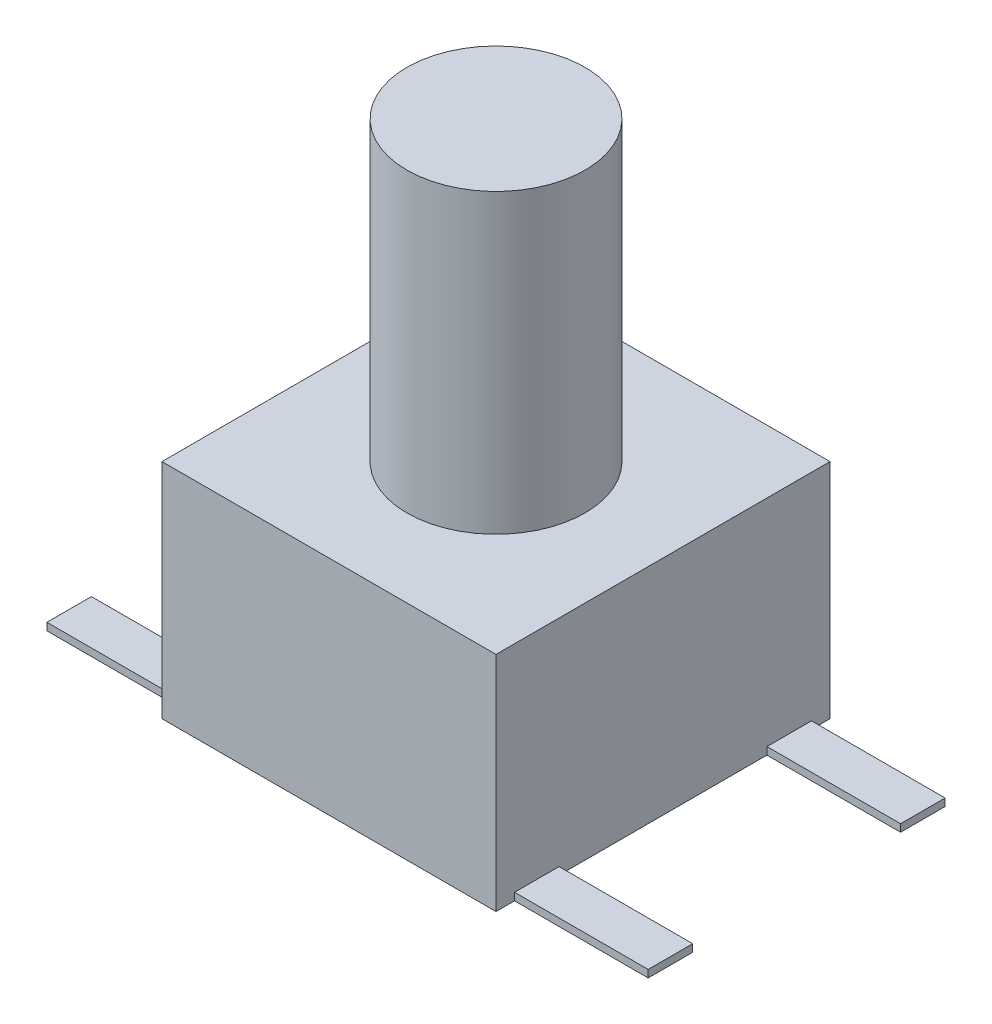
ISO-10303-21;
HEADER;
FILE_DESCRIPTION(('STEP AP214'),'2;1');
FILE_NAME('part.step','',(''),(''),'','','');
FILE_SCHEMA(('AUTOMOTIVE_DESIGN { 1 0 10303 214 1 1 1 1 }'));
ENDSEC;
DATA;
#1=APPLICATION_CONTEXT('core data for automotive mechanical design processes');
#2=APPLICATION_PROTOCOL_DEFINITION('international standard','automotive_design',2000,#1);
#3=PRODUCT_CONTEXT('',#1,'mechanical');
#4=PRODUCT('Part','Part','',(#3));
#5=PRODUCT_RELATED_PRODUCT_CATEGORY('part','',(#4));
#6=PRODUCT_DEFINITION_FORMATION('','',#4);
#7=PRODUCT_DEFINITION_CONTEXT('part definition',#1,'design');
#8=PRODUCT_DEFINITION('design','',#6,#7);
#9=PRODUCT_DEFINITION_SHAPE('','',#8);
#10=(LENGTH_UNIT() NAMED_UNIT(*) SI_UNIT(.MILLI.,.METRE.));
#11=(NAMED_UNIT(*) PLANE_ANGLE_UNIT() SI_UNIT($,.RADIAN.));
#12=(NAMED_UNIT(*) SI_UNIT($,.STERADIAN.) SOLID_ANGLE_UNIT());
#13=UNCERTAINTY_MEASURE_WITH_UNIT(LENGTH_MEASURE(1.E-05),#10,'distance_accuracy_value','');
#14=(GEOMETRIC_REPRESENTATION_CONTEXT(3) GLOBAL_UNCERTAINTY_ASSIGNED_CONTEXT((#13)) GLOBAL_UNIT_ASSIGNED_CONTEXT((#10,
#11,#12)) REPRESENTATION_CONTEXT('',''));
#15=CARTESIAN_POINT('',(0.,0.,0.));
#16=DIRECTION('',(0.,0.,1.));
#17=DIRECTION('',(1.,0.,0.));
#18=AXIS2_PLACEMENT_3D('',#15,#16,#17);
#19=CARTESIAN_POINT('',(2.25,0.1,2.));
#20=DIRECTION('',(0.,0.,-1.));
#21=DIRECTION('',(-1.,0.,0.));
#22=AXIS2_PLACEMENT_3D('',#19,#20,#21);
#23=PLANE('',#22);
#24=DIRECTION('',(1.,0.,0.));
#25=VECTOR('',#24,1.);
#26=CARTESIAN_POINT('',(2.25,0.,2.));
#27=LINE('',#26,#25);
#28=CARTESIAN_POINT('',(2.25,0.,2.));
#29=VERTEX_POINT('',#28);
#30=CARTESIAN_POINT('',(4.05,0.,2.));
#31=VERTEX_POINT('',#30);
#32=EDGE_CURVE('E111',#29,#31,#27,.T.);
#33=ORIENTED_EDGE('',*,*,#32,.T.);
#34=DIRECTION('',(0.,-1.,0.));
#35=VECTOR('',#34,1.);
#36=CARTESIAN_POINT('',(4.05,0.1,2.));
#37=LINE('',#36,#35);
#38=CARTESIAN_POINT('',(4.05,0.1,2.));
#39=VERTEX_POINT('',#38);
#40=EDGE_CURVE('E12',#39,#31,#37,.T.);
#41=ORIENTED_EDGE('',*,*,#40,.F.);
#42=DIRECTION('',(1.,0.,0.));
#43=VECTOR('',#42,1.);
#44=CARTESIAN_POINT('',(2.25,0.1,2.));
#45=LINE('',#44,#43);
#46=CARTESIAN_POINT('',(2.25,0.1,2.));
#47=VERTEX_POINT('',#46);
#48=EDGE_CURVE('E99',#47,#39,#45,.T.);
#49=ORIENTED_EDGE('',*,*,#48,.F.);
#50=DIRECTION('',(0.,-1.,0.));
#51=VECTOR('',#50,1.);
#52=CARTESIAN_POINT('',(2.25,0.1,2.));
#53=LINE('',#52,#51);
#54=EDGE_CURVE('E107',#47,#29,#53,.T.);
#55=ORIENTED_EDGE('',*,*,#54,.T.);
#56=EDGE_LOOP('',(#33,#41,#49,#55));
#57=FACE_BOUND('',#56,.T.);
#58=ADVANCED_FACE('F48',(#57),#23,.F.);
#59=CARTESIAN_POINT('',(4.05,0.1,2.));
#60=DIRECTION('',(-1.,0.,0.));
#61=DIRECTION('',(0.,0.,1.));
#62=AXIS2_PLACEMENT_3D('',#59,#60,#61);
#63=PLANE('',#62);
#64=DIRECTION('',(0.,0.,-1.));
#65=VECTOR('',#64,1.);
#66=CARTESIAN_POINT('',(4.05,0.,2.));
#67=LINE('',#66,#65);
#68=CARTESIAN_POINT('',(4.05,0.,1.4));
#69=VERTEX_POINT('',#68);
#70=EDGE_CURVE('E103',#31,#69,#67,.T.);
#71=ORIENTED_EDGE('',*,*,#70,.T.);
#72=DIRECTION('',(0.,-1.,0.));
#73=VECTOR('',#72,1.);
#74=CARTESIAN_POINT('',(4.05,0.1,1.4));
#75=LINE('',#74,#73);
#76=CARTESIAN_POINT('',(4.05,0.1,1.4));
#77=VERTEX_POINT('',#76);
#78=EDGE_CURVE('E56',#77,#69,#75,.T.);
#79=ORIENTED_EDGE('',*,*,#78,.F.);
#80=DIRECTION('',(0.,0.,-1.));
#81=VECTOR('',#80,1.);
#82=CARTESIAN_POINT('',(4.05,0.1,2.));
#83=LINE('',#82,#81);
#84=EDGE_CURVE('E94',#39,#77,#83,.T.);
#85=ORIENTED_EDGE('',*,*,#84,.F.);
#86=ORIENTED_EDGE('',*,*,#40,.T.);
#87=EDGE_LOOP('',(#71,#79,#85,#86));
#88=FACE_BOUND('',#87,.T.);
#89=ADVANCED_FACE('F102',(#88),#63,.F.);
#90=CARTESIAN_POINT('',(2.25,0.1,1.4));
#91=DIRECTION('',(0.,0.,1.));
#92=DIRECTION('',(1.,0.,0.));
#93=AXIS2_PLACEMENT_3D('',#90,#91,#92);
#94=PLANE('',#93);
#95=DIRECTION('',(-1.,0.,0.));
#96=VECTOR('',#95,1.);
#97=CARTESIAN_POINT('',(2.25,0.,1.4));
#98=LINE('',#97,#96);
#99=CARTESIAN_POINT('',(2.25,0.,1.4));
#100=VERTEX_POINT('',#99);
#101=EDGE_CURVE('E81',#69,#100,#98,.T.);
#102=ORIENTED_EDGE('',*,*,#101,.T.);
#103=DIRECTION('',(0.,-1.,0.));
#104=VECTOR('',#103,1.);
#105=CARTESIAN_POINT('',(2.25,0.1,1.4));
#106=LINE('',#105,#104);
#107=CARTESIAN_POINT('',(2.25,0.1,1.4));
#108=VERTEX_POINT('',#107);
#109=EDGE_CURVE('E104',#108,#100,#106,.T.);
#110=ORIENTED_EDGE('',*,*,#109,.F.);
#111=DIRECTION('',(-1.,0.,0.));
#112=VECTOR('',#111,1.);
#113=CARTESIAN_POINT('',(2.25,0.1,1.4));
#114=LINE('',#113,#112);
#115=EDGE_CURVE('E97',#77,#108,#114,.T.);
#116=ORIENTED_EDGE('',*,*,#115,.F.);
#117=ORIENTED_EDGE('',*,*,#78,.T.);
#118=EDGE_LOOP('',(#102,#110,#116,#117));
#119=FACE_BOUND('',#118,.T.);
#120=ADVANCED_FACE('F105',(#119),#94,.F.);
#121=CARTESIAN_POINT('',(2.25,0.1,2.));
#122=DIRECTION('',(1.,0.,0.));
#123=DIRECTION('',(0.,0.,-1.));
#124=AXIS2_PLACEMENT_3D('',#121,#122,#123);
#125=PLANE('',#124);
#126=DIRECTION('',(0.,0.,1.));
#127=VECTOR('',#126,1.);
#128=CARTESIAN_POINT('',(2.25,0.,2.));
#129=LINE('',#128,#127);
#130=EDGE_CURVE('E87',#100,#29,#129,.T.);
#131=ORIENTED_EDGE('',*,*,#130,.T.);
#132=ORIENTED_EDGE('',*,*,#54,.F.);
#133=DIRECTION('',(0.,0.,1.));
#134=VECTOR('',#133,1.);
#135=CARTESIAN_POINT('',(2.25,0.1,2.));
#136=LINE('',#135,#134);
#137=EDGE_CURVE('E64',#108,#47,#136,.T.);
#138=ORIENTED_EDGE('',*,*,#137,.F.);
#139=ORIENTED_EDGE('',*,*,#109,.T.);
#140=EDGE_LOOP('',(#131,#132,#138,#139));
#141=FACE_BOUND('',#140,.T.);
#142=ADVANCED_FACE('F118',(#141),#125,.F.);
#143=CARTESIAN_POINT('',(0.,0.1,0.));
#144=DIRECTION('',(0.,1.,0.));
#145=DIRECTION('',(0.,0.,1.));
#146=AXIS2_PLACEMENT_3D('',#143,#144,#145);
#147=PLANE('',#146);
#148=ORIENTED_EDGE('',*,*,#48,.T.);
#149=ORIENTED_EDGE('',*,*,#84,.T.);
#150=ORIENTED_EDGE('',*,*,#115,.T.);
#151=ORIENTED_EDGE('',*,*,#137,.T.);
#152=EDGE_LOOP('',(#148,#149,#150,#151));
#153=FACE_BOUND('',#152,.T.);
#154=ADVANCED_FACE('F95',(#153),#147,.T.);
#155=CARTESIAN_POINT('',(0.,0.,0.));
#156=DIRECTION('',(0.,1.,0.));
#157=DIRECTION('',(0.,0.,1.));
#158=AXIS2_PLACEMENT_3D('',#155,#156,#157);
#159=PLANE('',#158);
#160=ORIENTED_EDGE('',*,*,#32,.F.);
#161=ORIENTED_EDGE('',*,*,#130,.F.);
#162=ORIENTED_EDGE('',*,*,#101,.F.);
#163=ORIENTED_EDGE('',*,*,#70,.F.);
#164=EDGE_LOOP('',(#160,#161,#162,#163));
#165=FACE_BOUND('',#164,.T.);
#166=ADVANCED_FACE('F121',(#165),#159,.F.);
#167=CLOSED_SHELL('',(#58,#89,#120,#142,#154,#166));
#168=MANIFOLD_SOLID_BREP('B2',#167);
#169=CARTESIAN_POINT('',(2.25,0.1,-2.));
#170=DIRECTION('',(1.,0.,0.));
#171=DIRECTION('',(0.,0.,-1.));
#172=AXIS2_PLACEMENT_3D('',#169,#170,#171);
#173=PLANE('',#172);
#174=DIRECTION('',(0.,0.,1.));
#175=VECTOR('',#174,1.);
#176=CARTESIAN_POINT('',(2.25,0.,-2.));
#177=LINE('',#176,#175);
#178=CARTESIAN_POINT('',(2.25,0.,-2.));
#179=VERTEX_POINT('',#178);
#180=CARTESIAN_POINT('',(2.25,0.,-1.4));
#181=VERTEX_POINT('',#180);
#182=EDGE_CURVE('E245',#179,#181,#177,.T.);
#183=ORIENTED_EDGE('',*,*,#182,.T.);
#184=DIRECTION('',(0.,-1.,0.));
#185=VECTOR('',#184,1.);
#186=CARTESIAN_POINT('',(2.25,0.1,-1.4));
#187=LINE('',#186,#185);
#188=CARTESIAN_POINT('',(2.25,0.1,-1.4));
#189=VERTEX_POINT('',#188);
#190=EDGE_CURVE('E46',#189,#181,#187,.T.);
#191=ORIENTED_EDGE('',*,*,#190,.F.);
#192=DIRECTION('',(0.,0.,1.));
#193=VECTOR('',#192,1.);
#194=CARTESIAN_POINT('',(2.25,0.1,-2.));
#195=LINE('',#194,#193);
#196=CARTESIAN_POINT('',(2.25,0.1,-2.));
#197=VERTEX_POINT('',#196);
#198=EDGE_CURVE('E233',#197,#189,#195,.T.);
#199=ORIENTED_EDGE('',*,*,#198,.F.);
#200=DIRECTION('',(0.,-1.,0.));
#201=VECTOR('',#200,1.);
#202=CARTESIAN_POINT('',(2.25,0.1,-2.));
#203=LINE('',#202,#201);
#204=EDGE_CURVE('E241',#197,#179,#203,.T.);
#205=ORIENTED_EDGE('',*,*,#204,.T.);
#206=EDGE_LOOP('',(#183,#191,#199,#205));
#207=FACE_BOUND('',#206,.T.);
#208=ADVANCED_FACE('F182',(#207),#173,.F.);
#209=CARTESIAN_POINT('',(2.25,0.1,-1.4));
#210=DIRECTION('',(0.,0.,-1.));
#211=DIRECTION('',(-1.,0.,0.));
#212=AXIS2_PLACEMENT_3D('',#209,#210,#211);
#213=PLANE('',#212);
#214=DIRECTION('',(1.,0.,0.));
#215=VECTOR('',#214,1.);
#216=CARTESIAN_POINT('',(2.25,0.,-1.4));
#217=LINE('',#216,#215);
#218=CARTESIAN_POINT('',(4.05,0.,-1.4));
#219=VERTEX_POINT('',#218);
#220=EDGE_CURVE('E237',#181,#219,#217,.T.);
#221=ORIENTED_EDGE('',*,*,#220,.T.);
#222=DIRECTION('',(0.,-1.,0.));
#223=VECTOR('',#222,1.);
#224=CARTESIAN_POINT('',(4.05,0.1,-1.4));
#225=LINE('',#224,#223);
#226=CARTESIAN_POINT('',(4.05,0.1,-1.4));
#227=VERTEX_POINT('',#226);
#228=EDGE_CURVE('E190',#227,#219,#225,.T.);
#229=ORIENTED_EDGE('',*,*,#228,.F.);
#230=DIRECTION('',(1.,0.,0.));
#231=VECTOR('',#230,1.);
#232=CARTESIAN_POINT('',(2.25,0.1,-1.4));
#233=LINE('',#232,#231);
#234=EDGE_CURVE('E228',#189,#227,#233,.T.);
#235=ORIENTED_EDGE('',*,*,#234,.F.);
#236=ORIENTED_EDGE('',*,*,#190,.T.);
#237=EDGE_LOOP('',(#221,#229,#235,#236));
#238=FACE_BOUND('',#237,.T.);
#239=ADVANCED_FACE('F236',(#238),#213,.F.);
#240=CARTESIAN_POINT('',(4.05,0.1,-2.));
#241=DIRECTION('',(-1.,0.,0.));
#242=DIRECTION('',(0.,0.,1.));
#243=AXIS2_PLACEMENT_3D('',#240,#241,#242);
#244=PLANE('',#243);
#245=DIRECTION('',(0.,0.,-1.));
#246=VECTOR('',#245,1.);
#247=CARTESIAN_POINT('',(4.05,0.,-2.));
#248=LINE('',#247,#246);
#249=CARTESIAN_POINT('',(4.05,0.,-2.));
#250=VERTEX_POINT('',#249);
#251=EDGE_CURVE('E215',#219,#250,#248,.T.);
#252=ORIENTED_EDGE('',*,*,#251,.T.);
#253=DIRECTION('',(0.,-1.,0.));
#254=VECTOR('',#253,1.);
#255=CARTESIAN_POINT('',(4.05,0.1,-2.));
#256=LINE('',#255,#254);
#257=CARTESIAN_POINT('',(4.05,0.1,-2.));
#258=VERTEX_POINT('',#257);
#259=EDGE_CURVE('E238',#258,#250,#256,.T.);
#260=ORIENTED_EDGE('',*,*,#259,.F.);
#261=DIRECTION('',(0.,0.,-1.));
#262=VECTOR('',#261,1.);
#263=CARTESIAN_POINT('',(4.05,0.1,-2.));
#264=LINE('',#263,#262);
#265=EDGE_CURVE('E231',#227,#258,#264,.T.);
#266=ORIENTED_EDGE('',*,*,#265,.F.);
#267=ORIENTED_EDGE('',*,*,#228,.T.);
#268=EDGE_LOOP('',(#252,#260,#266,#267));
#269=FACE_BOUND('',#268,.T.);
#270=ADVANCED_FACE('F239',(#269),#244,.F.);
#271=CARTESIAN_POINT('',(2.25,0.1,-2.));
#272=DIRECTION('',(0.,0.,1.));
#273=DIRECTION('',(1.,0.,0.));
#274=AXIS2_PLACEMENT_3D('',#271,#272,#273);
#275=PLANE('',#274);
#276=DIRECTION('',(-1.,0.,0.));
#277=VECTOR('',#276,1.);
#278=CARTESIAN_POINT('',(2.25,0.,-2.));
#279=LINE('',#278,#277);
#280=EDGE_CURVE('E221',#250,#179,#279,.T.);
#281=ORIENTED_EDGE('',*,*,#280,.T.);
#282=ORIENTED_EDGE('',*,*,#204,.F.);
#283=DIRECTION('',(-1.,0.,0.));
#284=VECTOR('',#283,1.);
#285=CARTESIAN_POINT('',(2.25,0.1,-2.));
#286=LINE('',#285,#284);
#287=EDGE_CURVE('E198',#258,#197,#286,.T.);
#288=ORIENTED_EDGE('',*,*,#287,.F.);
#289=ORIENTED_EDGE('',*,*,#259,.T.);
#290=EDGE_LOOP('',(#281,#282,#288,#289));
#291=FACE_BOUND('',#290,.T.);
#292=ADVANCED_FACE('F252',(#291),#275,.F.);
#293=CARTESIAN_POINT('',(0.,0.1,0.));
#294=DIRECTION('',(0.,1.,0.));
#295=DIRECTION('',(0.,0.,1.));
#296=AXIS2_PLACEMENT_3D('',#293,#294,#295);
#297=PLANE('',#296);
#298=ORIENTED_EDGE('',*,*,#198,.T.);
#299=ORIENTED_EDGE('',*,*,#234,.T.);
#300=ORIENTED_EDGE('',*,*,#265,.T.);
#301=ORIENTED_EDGE('',*,*,#287,.T.);
#302=EDGE_LOOP('',(#298,#299,#300,#301));
#303=FACE_BOUND('',#302,.T.);
#304=ADVANCED_FACE('F229',(#303),#297,.T.);
#305=CARTESIAN_POINT('',(0.,0.,0.));
#306=DIRECTION('',(0.,1.,0.));
#307=DIRECTION('',(0.,0.,1.));
#308=AXIS2_PLACEMENT_3D('',#305,#306,#307);
#309=PLANE('',#308);
#310=ORIENTED_EDGE('',*,*,#182,.F.);
#311=ORIENTED_EDGE('',*,*,#280,.F.);
#312=ORIENTED_EDGE('',*,*,#251,.F.);
#313=ORIENTED_EDGE('',*,*,#220,.F.);
#314=EDGE_LOOP('',(#310,#311,#312,#313));
#315=FACE_BOUND('',#314,.T.);
#316=ADVANCED_FACE('F255',(#315),#309,.F.);
#317=CLOSED_SHELL('',(#208,#239,#270,#292,#304,#316));
#318=MANIFOLD_SOLID_BREP('B6',#317);
#319=CARTESIAN_POINT('',(-2.25,0.1,-2.));
#320=DIRECTION('',(0.,0.,1.));
#321=DIRECTION('',(1.,0.,0.));
#322=AXIS2_PLACEMENT_3D('',#319,#320,#321);
#323=PLANE('',#322);
#324=DIRECTION('',(-1.,0.,0.));
#325=VECTOR('',#324,1.);
#326=CARTESIAN_POINT('',(-2.25,0.,-2.));
#327=LINE('',#326,#325);
#328=CARTESIAN_POINT('',(-2.25,0.,-2.));
#329=VERTEX_POINT('',#328);
#330=CARTESIAN_POINT('',(-4.05,0.,-2.));
#331=VERTEX_POINT('',#330);
#332=EDGE_CURVE('E379',#329,#331,#327,.T.);
#333=ORIENTED_EDGE('',*,*,#332,.T.);
#334=DIRECTION('',(0.,-1.,0.));
#335=VECTOR('',#334,1.);
#336=CARTESIAN_POINT('',(-4.05,0.1,-2.));
#337=LINE('',#336,#335);
#338=CARTESIAN_POINT('',(-4.05,0.1,-2.));
#339=VERTEX_POINT('',#338);
#340=EDGE_CURVE('E180',#339,#331,#337,.T.);
#341=ORIENTED_EDGE('',*,*,#340,.F.);
#342=DIRECTION('',(-1.,0.,0.));
#343=VECTOR('',#342,1.);
#344=CARTESIAN_POINT('',(-2.25,0.1,-2.));
#345=LINE('',#344,#343);
#346=CARTESIAN_POINT('',(-2.25,0.1,-2.));
#347=VERTEX_POINT('',#346);
#348=EDGE_CURVE('E367',#347,#339,#345,.T.);
#349=ORIENTED_EDGE('',*,*,#348,.F.);
#350=DIRECTION('',(0.,-1.,0.));
#351=VECTOR('',#350,1.);
#352=CARTESIAN_POINT('',(-2.25,0.1,-2.));
#353=LINE('',#352,#351);
#354=EDGE_CURVE('E375',#347,#329,#353,.T.);
#355=ORIENTED_EDGE('',*,*,#354,.T.);
#356=EDGE_LOOP('',(#333,#341,#349,#355));
#357=FACE_BOUND('',#356,.T.);
#358=ADVANCED_FACE('F316',(#357),#323,.F.);
#359=CARTESIAN_POINT('',(-4.05,0.1,-2.));
#360=DIRECTION('',(1.,0.,0.));
#361=DIRECTION('',(0.,0.,-1.));
#362=AXIS2_PLACEMENT_3D('',#359,#360,#361);
#363=PLANE('',#362);
#364=DIRECTION('',(0.,0.,1.));
#365=VECTOR('',#364,1.);
#366=CARTESIAN_POINT('',(-4.05,0.,-2.));
#367=LINE('',#366,#365);
#368=CARTESIAN_POINT('',(-4.05,0.,-1.4));
#369=VERTEX_POINT('',#368);
#370=EDGE_CURVE('E371',#331,#369,#367,.T.);
#371=ORIENTED_EDGE('',*,*,#370,.T.);
#372=DIRECTION('',(0.,-1.,0.));
#373=VECTOR('',#372,1.);
#374=CARTESIAN_POINT('',(-4.05,0.1,-1.4));
#375=LINE('',#374,#373);
#376=CARTESIAN_POINT('',(-4.05,0.1,-1.4));
#377=VERTEX_POINT('',#376);
#378=EDGE_CURVE('E324',#377,#369,#375,.T.);
#379=ORIENTED_EDGE('',*,*,#378,.F.);
#380=DIRECTION('',(0.,0.,1.));
#381=VECTOR('',#380,1.);
#382=CARTESIAN_POINT('',(-4.05,0.1,-2.));
#383=LINE('',#382,#381);
#384=EDGE_CURVE('E362',#339,#377,#383,.T.);
#385=ORIENTED_EDGE('',*,*,#384,.F.);
#386=ORIENTED_EDGE('',*,*,#340,.T.);
#387=EDGE_LOOP('',(#371,#379,#385,#386));
#388=FACE_BOUND('',#387,.T.);
#389=ADVANCED_FACE('F370',(#388),#363,.F.);
#390=CARTESIAN_POINT('',(-2.25,0.1,-1.4));
#391=DIRECTION('',(0.,0.,-1.));
#392=DIRECTION('',(-1.,0.,0.));
#393=AXIS2_PLACEMENT_3D('',#390,#391,#392);
#394=PLANE('',#393);
#395=DIRECTION('',(1.,0.,0.));
#396=VECTOR('',#395,1.);
#397=CARTESIAN_POINT('',(-2.25,0.,-1.4));
#398=LINE('',#397,#396);
#399=CARTESIAN_POINT('',(-2.25,0.,-1.4));
#400=VERTEX_POINT('',#399);
#401=EDGE_CURVE('E349',#369,#400,#398,.T.);
#402=ORIENTED_EDGE('',*,*,#401,.T.);
#403=DIRECTION('',(0.,-1.,0.));
#404=VECTOR('',#403,1.);
#405=CARTESIAN_POINT('',(-2.25,0.1,-1.4));
#406=LINE('',#405,#404);
#407=CARTESIAN_POINT('',(-2.25,0.1,-1.4));
#408=VERTEX_POINT('',#407);
#409=EDGE_CURVE('E372',#408,#400,#406,.T.);
#410=ORIENTED_EDGE('',*,*,#409,.F.);
#411=DIRECTION('',(1.,0.,0.));
#412=VECTOR('',#411,1.);
#413=CARTESIAN_POINT('',(-2.25,0.1,-1.4));
#414=LINE('',#413,#412);
#415=EDGE_CURVE('E365',#377,#408,#414,.T.);
#416=ORIENTED_EDGE('',*,*,#415,.F.);
#417=ORIENTED_EDGE('',*,*,#378,.T.);
#418=EDGE_LOOP('',(#402,#410,#416,#417));
#419=FACE_BOUND('',#418,.T.);
#420=ADVANCED_FACE('F373',(#419),#394,.F.);
#421=CARTESIAN_POINT('',(-2.25,0.1,-2.));
#422=DIRECTION('',(-1.,0.,0.));
#423=DIRECTION('',(0.,0.,1.));
#424=AXIS2_PLACEMENT_3D('',#421,#422,#423);
#425=PLANE('',#424);
#426=DIRECTION('',(0.,0.,-1.));
#427=VECTOR('',#426,1.);
#428=CARTESIAN_POINT('',(-2.25,0.,-2.));
#429=LINE('',#428,#427);
#430=EDGE_CURVE('E355',#400,#329,#429,.T.);
#431=ORIENTED_EDGE('',*,*,#430,.T.);
#432=ORIENTED_EDGE('',*,*,#354,.F.);
#433=DIRECTION('',(0.,0.,-1.));
#434=VECTOR('',#433,1.);
#435=CARTESIAN_POINT('',(-2.25,0.1,-2.));
#436=LINE('',#435,#434);
#437=EDGE_CURVE('E332',#408,#347,#436,.T.);
#438=ORIENTED_EDGE('',*,*,#437,.F.);
#439=ORIENTED_EDGE('',*,*,#409,.T.);
#440=EDGE_LOOP('',(#431,#432,#438,#439));
#441=FACE_BOUND('',#440,.T.);
#442=ADVANCED_FACE('F386',(#441),#425,.F.);
#443=CARTESIAN_POINT('',(0.,0.1,0.));
#444=DIRECTION('',(0.,1.,0.));
#445=DIRECTION('',(0.,0.,1.));
#446=AXIS2_PLACEMENT_3D('',#443,#444,#445);
#447=PLANE('',#446);
#448=ORIENTED_EDGE('',*,*,#348,.T.);
#449=ORIENTED_EDGE('',*,*,#384,.T.);
#450=ORIENTED_EDGE('',*,*,#415,.T.);
#451=ORIENTED_EDGE('',*,*,#437,.T.);
#452=EDGE_LOOP('',(#448,#449,#450,#451));
#453=FACE_BOUND('',#452,.T.);
#454=ADVANCED_FACE('F363',(#453),#447,.T.);
#455=CARTESIAN_POINT('',(0.,0.,0.));
#456=DIRECTION('',(0.,1.,0.));
#457=DIRECTION('',(0.,0.,1.));
#458=AXIS2_PLACEMENT_3D('',#455,#456,#457);
#459=PLANE('',#458);
#460=ORIENTED_EDGE('',*,*,#332,.F.);
#461=ORIENTED_EDGE('',*,*,#430,.F.);
#462=ORIENTED_EDGE('',*,*,#401,.F.);
#463=ORIENTED_EDGE('',*,*,#370,.F.);
#464=EDGE_LOOP('',(#460,#461,#462,#463));
#465=FACE_BOUND('',#464,.T.);
#466=ADVANCED_FACE('F389',(#465),#459,.F.);
#467=CLOSED_SHELL('',(#358,#389,#420,#442,#454,#466));
#468=MANIFOLD_SOLID_BREP('B40',#467);
#469=CARTESIAN_POINT('',(-2.25,0.1,2.));
#470=DIRECTION('',(-1.,0.,0.));
#471=DIRECTION('',(0.,0.,1.));
#472=AXIS2_PLACEMENT_3D('',#469,#470,#471);
#473=PLANE('',#472);
#474=DIRECTION('',(0.,0.,-1.));
#475=VECTOR('',#474,1.);
#476=CARTESIAN_POINT('',(-2.25,0.,2.));
#477=LINE('',#476,#475);
#478=CARTESIAN_POINT('',(-2.25,0.,2.));
#479=VERTEX_POINT('',#478);
#480=CARTESIAN_POINT('',(-2.25,0.,1.4));
#481=VERTEX_POINT('',#480);
#482=EDGE_CURVE('E512',#479,#481,#477,.T.);
#483=ORIENTED_EDGE('',*,*,#482,.T.);
#484=DIRECTION('',(0.,-1.,0.));
#485=VECTOR('',#484,1.);
#486=CARTESIAN_POINT('',(-2.25,0.1,1.4));
#487=LINE('',#486,#485);
#488=CARTESIAN_POINT('',(-2.25,0.1,1.4));
#489=VERTEX_POINT('',#488);
#490=EDGE_CURVE('E314',#489,#481,#487,.T.);
#491=ORIENTED_EDGE('',*,*,#490,.F.);
#492=DIRECTION('',(0.,0.,-1.));
#493=VECTOR('',#492,1.);
#494=CARTESIAN_POINT('',(-2.25,0.1,2.));
#495=LINE('',#494,#493);
#496=CARTESIAN_POINT('',(-2.25,0.1,2.));
#497=VERTEX_POINT('',#496);
#498=EDGE_CURVE('E500',#497,#489,#495,.T.);
#499=ORIENTED_EDGE('',*,*,#498,.F.);
#500=DIRECTION('',(0.,-1.,0.));
#501=VECTOR('',#500,1.);
#502=CARTESIAN_POINT('',(-2.25,0.1,2.));
#503=LINE('',#502,#501);
#504=EDGE_CURVE('E508',#497,#479,#503,.T.);
#505=ORIENTED_EDGE('',*,*,#504,.T.);
#506=EDGE_LOOP('',(#483,#491,#499,#505));
#507=FACE_BOUND('',#506,.T.);
#508=ADVANCED_FACE('F449',(#507),#473,.F.);
#509=CARTESIAN_POINT('',(-2.25,0.1,1.4));
#510=DIRECTION('',(0.,0.,1.));
#511=DIRECTION('',(1.,0.,0.));
#512=AXIS2_PLACEMENT_3D('',#509,#510,#511);
#513=PLANE('',#512);
#514=DIRECTION('',(-1.,0.,0.));
#515=VECTOR('',#514,1.);
#516=CARTESIAN_POINT('',(-2.25,0.,1.4));
#517=LINE('',#516,#515);
#518=CARTESIAN_POINT('',(-4.05,0.,1.4));
#519=VERTEX_POINT('',#518);
#520=EDGE_CURVE('E504',#481,#519,#517,.T.);
#521=ORIENTED_EDGE('',*,*,#520,.T.);
#522=DIRECTION('',(0.,-1.,0.));
#523=VECTOR('',#522,1.);
#524=CARTESIAN_POINT('',(-4.05,0.1,1.4));
#525=LINE('',#524,#523);
#526=CARTESIAN_POINT('',(-4.05,0.1,1.4));
#527=VERTEX_POINT('',#526);
#528=EDGE_CURVE('E457',#527,#519,#525,.T.);
#529=ORIENTED_EDGE('',*,*,#528,.F.);
#530=DIRECTION('',(-1.,0.,0.));
#531=VECTOR('',#530,1.);
#532=CARTESIAN_POINT('',(-2.25,0.1,1.4));
#533=LINE('',#532,#531);
#534=EDGE_CURVE('E495',#489,#527,#533,.T.);
#535=ORIENTED_EDGE('',*,*,#534,.F.);
#536=ORIENTED_EDGE('',*,*,#490,.T.);
#537=EDGE_LOOP('',(#521,#529,#535,#536));
#538=FACE_BOUND('',#537,.T.);
#539=ADVANCED_FACE('F503',(#538),#513,.F.);
#540=CARTESIAN_POINT('',(-4.05,0.1,2.));
#541=DIRECTION('',(1.,0.,0.));
#542=DIRECTION('',(0.,0.,-1.));
#543=AXIS2_PLACEMENT_3D('',#540,#541,#542);
#544=PLANE('',#543);
#545=DIRECTION('',(0.,0.,1.));
#546=VECTOR('',#545,1.);
#547=CARTESIAN_POINT('',(-4.05,0.,2.));
#548=LINE('',#547,#546);
#549=CARTESIAN_POINT('',(-4.05,0.,2.));
#550=VERTEX_POINT('',#549);
#551=EDGE_CURVE('E482',#519,#550,#548,.T.);
#552=ORIENTED_EDGE('',*,*,#551,.T.);
#553=DIRECTION('',(0.,-1.,0.));
#554=VECTOR('',#553,1.);
#555=CARTESIAN_POINT('',(-4.05,0.1,2.));
#556=LINE('',#555,#554);
#557=CARTESIAN_POINT('',(-4.05,0.1,2.));
#558=VERTEX_POINT('',#557);
#559=EDGE_CURVE('E505',#558,#550,#556,.T.);
#560=ORIENTED_EDGE('',*,*,#559,.F.);
#561=DIRECTION('',(0.,0.,1.));
#562=VECTOR('',#561,1.);
#563=CARTESIAN_POINT('',(-4.05,0.1,2.));
#564=LINE('',#563,#562);
#565=EDGE_CURVE('E498',#527,#558,#564,.T.);
#566=ORIENTED_EDGE('',*,*,#565,.F.);
#567=ORIENTED_EDGE('',*,*,#528,.T.);
#568=EDGE_LOOP('',(#552,#560,#566,#567));
#569=FACE_BOUND('',#568,.T.);
#570=ADVANCED_FACE('F506',(#569),#544,.F.);
#571=CARTESIAN_POINT('',(-2.25,0.1,2.));
#572=DIRECTION('',(0.,0.,-1.));
#573=DIRECTION('',(-1.,0.,0.));
#574=AXIS2_PLACEMENT_3D('',#571,#572,#573);
#575=PLANE('',#574);
#576=DIRECTION('',(1.,0.,0.));
#577=VECTOR('',#576,1.);
#578=CARTESIAN_POINT('',(-2.25,0.,2.));
#579=LINE('',#578,#577);
#580=EDGE_CURVE('E488',#550,#479,#579,.T.);
#581=ORIENTED_EDGE('',*,*,#580,.T.);
#582=ORIENTED_EDGE('',*,*,#504,.F.);
#583=DIRECTION('',(1.,0.,0.));
#584=VECTOR('',#583,1.);
#585=CARTESIAN_POINT('',(-2.25,0.1,2.));
#586=LINE('',#585,#584);
#587=EDGE_CURVE('E465',#558,#497,#586,.T.);
#588=ORIENTED_EDGE('',*,*,#587,.F.);
#589=ORIENTED_EDGE('',*,*,#559,.T.);
#590=EDGE_LOOP('',(#581,#582,#588,#589));
#591=FACE_BOUND('',#590,.T.);
#592=ADVANCED_FACE('F519',(#591),#575,.F.);
#593=CARTESIAN_POINT('',(0.,0.1,0.));
#594=DIRECTION('',(0.,1.,0.));
#595=DIRECTION('',(0.,0.,1.));
#596=AXIS2_PLACEMENT_3D('',#593,#594,#595);
#597=PLANE('',#596);
#598=ORIENTED_EDGE('',*,*,#498,.T.);
#599=ORIENTED_EDGE('',*,*,#534,.T.);
#600=ORIENTED_EDGE('',*,*,#565,.T.);
#601=ORIENTED_EDGE('',*,*,#587,.T.);
#602=EDGE_LOOP('',(#598,#599,#600,#601));
#603=FACE_BOUND('',#602,.T.);
#604=ADVANCED_FACE('F496',(#603),#597,.T.);
#605=CARTESIAN_POINT('',(0.,0.,0.));
#606=DIRECTION('',(0.,1.,0.));
#607=DIRECTION('',(0.,0.,1.));
#608=AXIS2_PLACEMENT_3D('',#605,#606,#607);
#609=PLANE('',#608);
#610=ORIENTED_EDGE('',*,*,#482,.F.);
#611=ORIENTED_EDGE('',*,*,#580,.F.);
#612=ORIENTED_EDGE('',*,*,#551,.F.);
#613=ORIENTED_EDGE('',*,*,#520,.F.);
#614=EDGE_LOOP('',(#610,#611,#612,#613));
#615=FACE_BOUND('',#614,.T.);
#616=ADVANCED_FACE('F522',(#615),#609,.F.);
#617=CLOSED_SHELL('',(#508,#539,#570,#592,#604,#616));
#618=MANIFOLD_SOLID_BREP('B174',#617);
#619=CARTESIAN_POINT('',(-2.25,3.,-2.25));
#620=DIRECTION('',(1.,0.,0.));
#621=DIRECTION('',(0.,0.,-1.));
#622=AXIS2_PLACEMENT_3D('',#619,#620,#621);
#623=PLANE('',#622);
#624=DIRECTION('',(0.,0.,1.));
#625=VECTOR('',#624,1.);
#626=CARTESIAN_POINT('',(-2.25,0.,-2.25));
#627=LINE('',#626,#625);
#628=CARTESIAN_POINT('',(-2.25,0.,-2.25));
#629=VERTEX_POINT('',#628);
#630=CARTESIAN_POINT('',(-2.25,0.,2.25));
#631=VERTEX_POINT('',#630);
#632=EDGE_CURVE('E636',#629,#631,#627,.T.);
#633=ORIENTED_EDGE('',*,*,#632,.T.);
#634=DIRECTION('',(0.,-1.,0.));
#635=VECTOR('',#634,1.);
#636=CARTESIAN_POINT('',(-2.25,3.,2.25));
#637=LINE('',#636,#635);
#638=CARTESIAN_POINT('',(-2.25,3.,2.25));
#639=VERTEX_POINT('',#638);
#640=EDGE_CURVE('E447',#639,#631,#637,.T.);
#641=ORIENTED_EDGE('',*,*,#640,.F.);
#642=DIRECTION('',(0.,0.,1.));
#643=VECTOR('',#642,1.);
#644=CARTESIAN_POINT('',(-2.25,3.,-2.25));
#645=LINE('',#644,#643);
#646=CARTESIAN_POINT('',(-2.25,3.,-2.25));
#647=VERTEX_POINT('',#646);
#648=EDGE_CURVE('E624',#647,#639,#645,.T.);
#649=ORIENTED_EDGE('',*,*,#648,.F.);
#650=DIRECTION('',(0.,-1.,0.));
#651=VECTOR('',#650,1.);
#652=CARTESIAN_POINT('',(-2.25,3.,-2.25));
#653=LINE('',#652,#651);
#654=EDGE_CURVE('E632',#647,#629,#653,.T.);
#655=ORIENTED_EDGE('',*,*,#654,.T.);
#656=EDGE_LOOP('',(#633,#641,#649,#655));
#657=FACE_BOUND('',#656,.T.);
#658=ADVANCED_FACE('F573',(#657),#623,.F.);
#659=CARTESIAN_POINT('',(-2.25,3.,2.25));
#660=DIRECTION('',(0.,0.,-1.));
#661=DIRECTION('',(-1.,0.,0.));
#662=AXIS2_PLACEMENT_3D('',#659,#660,#661);
#663=PLANE('',#662);
#664=DIRECTION('',(1.,0.,0.));
#665=VECTOR('',#664,1.);
#666=CARTESIAN_POINT('',(-2.25,0.,2.25));
#667=LINE('',#666,#665);
#668=CARTESIAN_POINT('',(2.25,0.,2.25));
#669=VERTEX_POINT('',#668);
#670=EDGE_CURVE('E628',#631,#669,#667,.T.);
#671=ORIENTED_EDGE('',*,*,#670,.T.);
#672=DIRECTION('',(0.,-1.,0.));
#673=VECTOR('',#672,1.);
#674=CARTESIAN_POINT('',(2.25,3.,2.25));
#675=LINE('',#674,#673);
#676=CARTESIAN_POINT('',(2.25,3.,2.25));
#677=VERTEX_POINT('',#676);
#678=EDGE_CURVE('E581',#677,#669,#675,.T.);
#679=ORIENTED_EDGE('',*,*,#678,.F.);
#680=DIRECTION('',(1.,0.,0.));
#681=VECTOR('',#680,1.);
#682=CARTESIAN_POINT('',(-2.25,3.,2.25));
#683=LINE('',#682,#681);
#684=EDGE_CURVE('E619',#639,#677,#683,.T.);
#685=ORIENTED_EDGE('',*,*,#684,.F.);
#686=ORIENTED_EDGE('',*,*,#640,.T.);
#687=EDGE_LOOP('',(#671,#679,#685,#686));
#688=FACE_BOUND('',#687,.T.);
#689=ADVANCED_FACE('F627',(#688),#663,.F.);
#690=CARTESIAN_POINT('',(2.25,3.,-2.25));
#691=DIRECTION('',(-1.,0.,0.));
#692=DIRECTION('',(0.,0.,1.));
#693=AXIS2_PLACEMENT_3D('',#690,#691,#692);
#694=PLANE('',#693);
#695=DIRECTION('',(0.,0.,-1.));
#696=VECTOR('',#695,1.);
#697=CARTESIAN_POINT('',(2.25,0.,-2.25));
#698=LINE('',#697,#696);
#699=CARTESIAN_POINT('',(2.25,0.,-2.25));
#700=VERTEX_POINT('',#699);
#701=EDGE_CURVE('E606',#669,#700,#698,.T.);
#702=ORIENTED_EDGE('',*,*,#701,.T.);
#703=DIRECTION('',(0.,-1.,0.));
#704=VECTOR('',#703,1.);
#705=CARTESIAN_POINT('',(2.25,3.,-2.25));
#706=LINE('',#705,#704);
#707=CARTESIAN_POINT('',(2.25,3.,-2.25));
#708=VERTEX_POINT('',#707);
#709=EDGE_CURVE('E629',#708,#700,#706,.T.);
#710=ORIENTED_EDGE('',*,*,#709,.F.);
#711=DIRECTION('',(0.,0.,-1.));
#712=VECTOR('',#711,1.);
#713=CARTESIAN_POINT('',(2.25,3.,-2.25));
#714=LINE('',#713,#712);
#715=EDGE_CURVE('E622',#677,#708,#714,.T.);
#716=ORIENTED_EDGE('',*,*,#715,.F.);
#717=ORIENTED_EDGE('',*,*,#678,.T.);
#718=EDGE_LOOP('',(#702,#710,#716,#717));
#719=FACE_BOUND('',#718,.T.);
#720=ADVANCED_FACE('F630',(#719),#694,.F.);
#721=CARTESIAN_POINT('',(-2.25,3.,-2.25));
#722=DIRECTION('',(0.,0.,1.));
#723=DIRECTION('',(1.,0.,0.));
#724=AXIS2_PLACEMENT_3D('',#721,#722,#723);
#725=PLANE('',#724);
#726=DIRECTION('',(-1.,0.,0.));
#727=VECTOR('',#726,1.);
#728=CARTESIAN_POINT('',(-2.25,0.,-2.25));
#729=LINE('',#728,#727);
#730=EDGE_CURVE('E612',#700,#629,#729,.T.);
#731=ORIENTED_EDGE('',*,*,#730,.T.);
#732=ORIENTED_EDGE('',*,*,#654,.F.);
#733=DIRECTION('',(-1.,0.,0.));
#734=VECTOR('',#733,1.);
#735=CARTESIAN_POINT('',(-2.25,3.,-2.25));
#736=LINE('',#735,#734);
#737=EDGE_CURVE('E589',#708,#647,#736,.T.);
#738=ORIENTED_EDGE('',*,*,#737,.F.);
#739=ORIENTED_EDGE('',*,*,#709,.T.);
#740=EDGE_LOOP('',(#731,#732,#738,#739));
#741=FACE_BOUND('',#740,.T.);
#742=ADVANCED_FACE('F644',(#741),#725,.F.);
#743=CARTESIAN_POINT('',(0.,3.,0.));
#744=DIRECTION('',(0.,1.,0.));
#745=DIRECTION('',(0.,0.,1.));
#746=AXIS2_PLACEMENT_3D('',#743,#744,#745);
#747=PLANE('',#746);
#748=CARTESIAN_POINT('',(0.,3.,0.));
#749=DIRECTION('',(0.,1.,0.));
#750=DIRECTION('',(0.,0.,1.));
#751=AXIS2_PLACEMENT_3D('',#748,#749,#750);
#752=CIRCLE('',#751,1.2);
#753=CARTESIAN_POINT('',(0.,3.,1.2));
#754=VERTEX_POINT('',#753);
#755=EDGE_CURVE('E639',#754,#754,#752,.F.);
#756=ORIENTED_EDGE('',*,*,#755,.T.);
#757=EDGE_LOOP('',(#756));
#758=FACE_BOUND('',#757,.T.);
#759=ORIENTED_EDGE('',*,*,#648,.T.);
#760=ORIENTED_EDGE('',*,*,#684,.T.);
#761=ORIENTED_EDGE('',*,*,#715,.T.);
#762=ORIENTED_EDGE('',*,*,#737,.T.);
#763=EDGE_LOOP('',(#759,#760,#761,#762));
#764=FACE_BOUND('',#763,.T.);
#765=ADVANCED_FACE('F620',(#758,#764),#747,.T.);
#766=CARTESIAN_POINT('',(0.,0.,0.));
#767=DIRECTION('',(0.,1.,0.));
#768=DIRECTION('',(0.,0.,1.));
#769=AXIS2_PLACEMENT_3D('',#766,#767,#768);
#770=PLANE('',#769);
#771=ORIENTED_EDGE('',*,*,#632,.F.);
#772=ORIENTED_EDGE('',*,*,#730,.F.);
#773=ORIENTED_EDGE('',*,*,#701,.F.);
#774=ORIENTED_EDGE('',*,*,#670,.F.);
#775=EDGE_LOOP('',(#771,#772,#773,#774));
#776=FACE_BOUND('',#775,.T.);
#777=ADVANCED_FACE('F647',(#776),#770,.F.);
#778=CARTESIAN_POINT('',(0.,7.,0.));
#779=DIRECTION('',(0.,-1.,0.));
#780=DIRECTION('',(0.,0.,-1.));
#781=AXIS2_PLACEMENT_3D('',#778,#779,#780);
#782=CYLINDRICAL_SURFACE('',#781,1.2);
#783=ORIENTED_EDGE('',*,*,#755,.F.);
#784=EDGE_LOOP('',(#783));
#785=FACE_BOUND('',#784,.T.);
#786=CARTESIAN_POINT('',(0.,7.,0.));
#787=DIRECTION('',(0.,1.,0.));
#788=DIRECTION('',(0.,0.,1.));
#789=AXIS2_PLACEMENT_3D('',#786,#787,#788);
#790=CIRCLE('',#789,1.2);
#791=CARTESIAN_POINT('',(0.,7.,1.2));
#792=VERTEX_POINT('',#791);
#793=EDGE_CURVE('E652',#792,#792,#790,.T.);
#794=ORIENTED_EDGE('',*,*,#793,.F.);
#795=EDGE_LOOP('',(#794));
#796=FACE_BOUND('',#795,.T.);
#797=ADVANCED_FACE('F658',(#785,#796),#782,.T.);
#798=CARTESIAN_POINT('',(0.,7.,0.));
#799=DIRECTION('',(0.,1.,0.));
#800=DIRECTION('',(0.,0.,1.));
#801=AXIS2_PLACEMENT_3D('',#798,#799,#800);
#802=PLANE('',#801);
#803=ORIENTED_EDGE('',*,*,#793,.T.);
#804=EDGE_LOOP('',(#803));
#805=FACE_BOUND('',#804,.T.);
#806=ADVANCED_FACE('F656',(#805),#802,.T.);
#807=CLOSED_SHELL('',(#658,#689,#720,#742,#765,#777,#797,#806));
#808=MANIFOLD_SOLID_BREP('B308',#807);
#809=ADVANCED_BREP_SHAPE_REPRESENTATION('',(#18,#168,#318,#468,#618,#808),#14);
#810=SHAPE_DEFINITION_REPRESENTATION(#9,#809);
ENDSEC;
END-ISO-10303-21;
